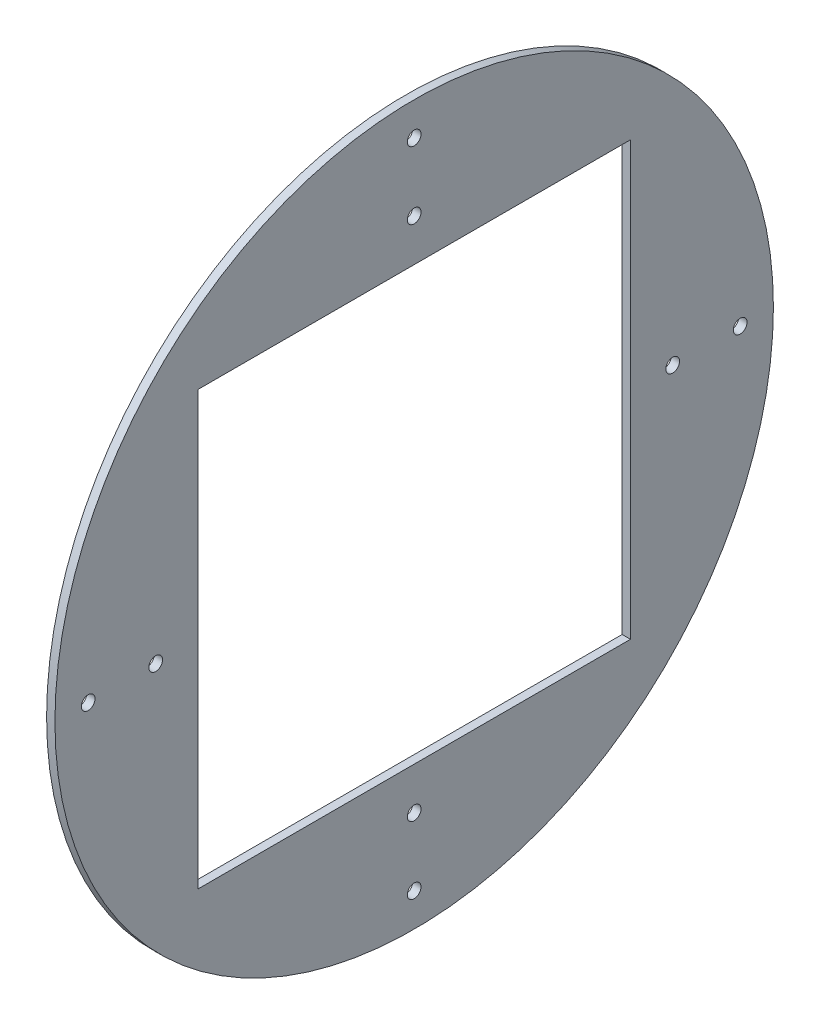
ISO-10303-21;
HEADER;
FILE_DESCRIPTION(('STEP AP214'),'2;1');
FILE_NAME('part.step','',(''),(''),'','','');
FILE_SCHEMA(('AUTOMOTIVE_DESIGN { 1 0 10303 214 1 1 1 1 }'));
ENDSEC;
DATA;
#1=APPLICATION_CONTEXT('core data for automotive mechanical design processes');
#2=APPLICATION_PROTOCOL_DEFINITION('international standard','automotive_design',2000,#1);
#3=PRODUCT_CONTEXT('',#1,'mechanical');
#4=PRODUCT('Part','Part','',(#3));
#5=PRODUCT_RELATED_PRODUCT_CATEGORY('part','',(#4));
#6=PRODUCT_DEFINITION_FORMATION('','',#4);
#7=PRODUCT_DEFINITION_CONTEXT('part definition',#1,'design');
#8=PRODUCT_DEFINITION('design','',#6,#7);
#9=PRODUCT_DEFINITION_SHAPE('','',#8);
#10=(LENGTH_UNIT() NAMED_UNIT(*) SI_UNIT(.MILLI.,.METRE.));
#11=(NAMED_UNIT(*) PLANE_ANGLE_UNIT() SI_UNIT($,.RADIAN.));
#12=(NAMED_UNIT(*) SI_UNIT($,.STERADIAN.) SOLID_ANGLE_UNIT());
#13=UNCERTAINTY_MEASURE_WITH_UNIT(LENGTH_MEASURE(1.E-05),#10,'distance_accuracy_value','');
#14=(GEOMETRIC_REPRESENTATION_CONTEXT(3) GLOBAL_UNCERTAINTY_ASSIGNED_CONTEXT((#13)) GLOBAL_UNIT_ASSIGNED_CONTEXT((#10,
#11,#12)) REPRESENTATION_CONTEXT('',''));
#15=CARTESIAN_POINT('',(0.,0.,0.));
#16=DIRECTION('',(0.,0.,1.));
#17=DIRECTION('',(1.,0.,0.));
#18=AXIS2_PLACEMENT_3D('',#15,#16,#17);
#19=CARTESIAN_POINT('',(2.0066,0.,0.));
#20=DIRECTION('',(1.,0.,0.));
#21=DIRECTION('',(0.,0.,-1.));
#22=AXIS2_PLACEMENT_3D('',#19,#20,#21);
#23=PLANE('',#22);
#24=CARTESIAN_POINT('',(2.0066,-2.74032404360442E-13,78.486));
#25=DIRECTION('',(1.,0.,0.));
#26=DIRECTION('',(0.,1.,0.));
#27=AXIS2_PLACEMENT_3D('',#24,#25,#26);
#28=CIRCLE('',#27,1.65100000000001);
#29=CARTESIAN_POINT('',(2.0066,1.65099999999973,78.486));
#30=VERTEX_POINT('',#29);
#31=EDGE_CURVE('E263',#30,#30,#28,.T.);
#32=ORIENTED_EDGE('',*,*,#31,.F.);
#33=EDGE_LOOP('',(#32));
#34=FACE_BOUND('',#33,.T.);
#35=CARTESIAN_POINT('',(2.0066,6.51824651148624E-13,-62.23));
#36=DIRECTION('',(1.,0.,0.));
#37=DIRECTION('',(0.,-1.,0.));
#38=AXIS2_PLACEMENT_3D('',#35,#36,#37);
#39=CIRCLE('',#38,1.651);
#40=CARTESIAN_POINT('',(2.0066,-1.65099999999935,-62.23));
#41=VERTEX_POINT('',#40);
#42=EDGE_CURVE('E280',#41,#41,#39,.T.);
#43=ORIENTED_EDGE('',*,*,#42,.F.);
#44=EDGE_LOOP('',(#43));
#45=FACE_BOUND('',#44,.T.);
#46=CARTESIAN_POINT('',(2.0066,-2.17274883716208E-13,62.23));
#47=DIRECTION('',(1.,0.,0.));
#48=DIRECTION('',(0.,1.,0.));
#49=AXIS2_PLACEMENT_3D('',#46,#47,#48);
#50=CIRCLE('',#49,1.651);
#51=CARTESIAN_POINT('',(2.0066,1.65099999999978,62.23));
#52=VERTEX_POINT('',#51);
#53=EDGE_CURVE('E272',#52,#52,#50,.T.);
#54=ORIENTED_EDGE('',*,*,#53,.F.);
#55=EDGE_LOOP('',(#54));
#56=FACE_BOUND('',#55,.T.);
#57=CARTESIAN_POINT('',(2.0066,-78.486,0.));
#58=DIRECTION('',(1.,0.,0.));
#59=DIRECTION('',(0.,0.,1.));
#60=AXIS2_PLACEMENT_3D('',#57,#58,#59);
#61=CIRCLE('',#60,1.65100000000001);
#62=CARTESIAN_POINT('',(2.0066,-78.486,1.65100000000001));
#63=VERTEX_POINT('',#62);
#64=EDGE_CURVE('E288',#63,#63,#61,.T.);
#65=ORIENTED_EDGE('',*,*,#64,.F.);
#66=EDGE_LOOP('',(#65));
#67=FACE_BOUND('',#66,.T.);
#68=CARTESIAN_POINT('',(2.0066,-62.23,0.));
#69=DIRECTION('',(1.,0.,0.));
#70=DIRECTION('',(0.,0.,1.));
#71=AXIS2_PLACEMENT_3D('',#68,#69,#70);
#72=CIRCLE('',#71,1.651);
#73=CARTESIAN_POINT('',(2.0066,-62.23,1.651));
#74=VERTEX_POINT('',#73);
#75=EDGE_CURVE('E289',#74,#74,#72,.T.);
#76=ORIENTED_EDGE('',*,*,#75,.F.);
#77=EDGE_LOOP('',(#76));
#78=FACE_BOUND('',#77,.T.);
#79=CARTESIAN_POINT('',(2.0066,8.22097213081327E-13,-78.486));
#80=DIRECTION('',(1.,0.,0.));
#81=DIRECTION('',(0.,-1.,0.));
#82=AXIS2_PLACEMENT_3D('',#79,#80,#81);
#83=CIRCLE('',#82,1.65100000000001);
#84=CARTESIAN_POINT('',(2.0066,-1.65099999999918,-78.486));
#85=VERTEX_POINT('',#84);
#86=EDGE_CURVE('E279',#85,#85,#83,.T.);
#87=ORIENTED_EDGE('',*,*,#86,.F.);
#88=EDGE_LOOP('',(#87));
#89=FACE_BOUND('',#88,.T.);
#90=CARTESIAN_POINT('',(2.0066,78.486,0.));
#91=DIRECTION('',(1.,0.,0.));
#92=DIRECTION('',(0.,0.,-1.));
#93=AXIS2_PLACEMENT_3D('',#90,#91,#92);
#94=CIRCLE('',#93,1.65100000000001);
#95=CARTESIAN_POINT('',(2.0066,78.486,-1.65100000000001));
#96=VERTEX_POINT('',#95);
#97=EDGE_CURVE('E313',#96,#96,#94,.T.);
#98=ORIENTED_EDGE('',*,*,#97,.F.);
#99=EDGE_LOOP('',(#98));
#100=FACE_BOUND('',#99,.T.);
#101=CARTESIAN_POINT('',(2.0066,62.23,0.));
#102=DIRECTION('',(1.,0.,0.));
#103=DIRECTION('',(0.,0.,-1.));
#104=AXIS2_PLACEMENT_3D('',#101,#102,#103);
#105=CIRCLE('',#104,1.651);
#106=CARTESIAN_POINT('',(2.0066,62.23,-1.651));
#107=VERTEX_POINT('',#106);
#108=EDGE_CURVE('E317',#107,#107,#105,.T.);
#109=ORIENTED_EDGE('',*,*,#108,.F.);
#110=EDGE_LOOP('',(#109));
#111=FACE_BOUND('',#110,.T.);
#112=CARTESIAN_POINT('',(2.0066,0.,0.));
#113=DIRECTION('',(1.,0.,0.));
#114=DIRECTION('',(0.,0.,-1.));
#115=AXIS2_PLACEMENT_3D('',#112,#113,#114);
#116=CIRCLE('',#115,86.487);
#117=CARTESIAN_POINT('',(2.0066,0.,-86.487));
#118=VERTEX_POINT('',#117);
#119=EDGE_CURVE('E11',#118,#118,#116,.T.);
#120=ORIENTED_EDGE('',*,*,#119,.T.);
#121=EDGE_LOOP('',(#120));
#122=FACE_BOUND('',#121,.T.);
#123=DIRECTION('',(0.,-1.,0.));
#124=VECTOR('',#123,1.);
#125=CARTESIAN_POINT('',(2.0066,52.07,-52.07));
#126=LINE('',#125,#124);
#127=CARTESIAN_POINT('',(2.0066,52.07,-52.07));
#128=VERTEX_POINT('',#127);
#129=CARTESIAN_POINT('',(2.0066,-52.07,-52.07));
#130=VERTEX_POINT('',#129);
#131=EDGE_CURVE('E97',#128,#130,#126,.T.);
#132=ORIENTED_EDGE('',*,*,#131,.T.);
#133=DIRECTION('',(0.,0.,1.));
#134=VECTOR('',#133,1.);
#135=CARTESIAN_POINT('',(2.0066,-52.07,-52.07));
#136=LINE('',#135,#134);
#137=CARTESIAN_POINT('',(2.0066,-52.07,52.07));
#138=VERTEX_POINT('',#137);
#139=EDGE_CURVE('E61',#130,#138,#136,.T.);
#140=ORIENTED_EDGE('',*,*,#139,.T.);
#141=DIRECTION('',(0.,-1.,0.));
#142=VECTOR('',#141,1.);
#143=CARTESIAN_POINT('',(2.0066,52.07,52.07));
#144=LINE('',#143,#142);
#145=CARTESIAN_POINT('',(2.0066,52.07,52.07));
#146=VERTEX_POINT('',#145);
#147=EDGE_CURVE('E103',#146,#138,#144,.T.);
#148=ORIENTED_EDGE('',*,*,#147,.F.);
#149=DIRECTION('',(0.,0.,1.));
#150=VECTOR('',#149,1.);
#151=CARTESIAN_POINT('',(2.0066,52.07,-52.07));
#152=LINE('',#151,#150);
#153=EDGE_CURVE('E122',#128,#146,#152,.T.);
#154=ORIENTED_EDGE('',*,*,#153,.F.);
#155=EDGE_LOOP('',(#132,#140,#148,#154));
#156=FACE_BOUND('',#155,.T.);
#157=ADVANCED_FACE('F45',(#34,#45,#56,#67,#78,#89,#100,#111,#122,#156),#23,.T.);
#158=CARTESIAN_POINT('',(0.,0.,0.));
#159=DIRECTION('',(1.,0.,0.));
#160=DIRECTION('',(0.,0.,-1.));
#161=AXIS2_PLACEMENT_3D('',#158,#159,#160);
#162=PLANE('',#161);
#163=CARTESIAN_POINT('',(0.,-2.74032404360442E-13,78.486));
#164=DIRECTION('',(1.,0.,0.));
#165=DIRECTION('',(0.,1.,0.));
#166=AXIS2_PLACEMENT_3D('',#163,#164,#165);
#167=CIRCLE('',#166,1.65100000000001);
#168=CARTESIAN_POINT('',(0.,1.65099999999973,78.486));
#169=VERTEX_POINT('',#168);
#170=EDGE_CURVE('E261',#169,#169,#167,.T.);
#171=ORIENTED_EDGE('',*,*,#170,.T.);
#172=EDGE_LOOP('',(#171));
#173=FACE_BOUND('',#172,.T.);
#174=CARTESIAN_POINT('',(0.,6.51824651148624E-13,-62.23));
#175=DIRECTION('',(1.,0.,0.));
#176=DIRECTION('',(0.,-1.,0.));
#177=AXIS2_PLACEMENT_3D('',#174,#175,#176);
#178=CIRCLE('',#177,1.651);
#179=CARTESIAN_POINT('',(0.,-1.65099999999935,-62.23));
#180=VERTEX_POINT('',#179);
#181=EDGE_CURVE('E275',#180,#180,#178,.T.);
#182=ORIENTED_EDGE('',*,*,#181,.T.);
#183=EDGE_LOOP('',(#182));
#184=FACE_BOUND('',#183,.T.);
#185=CARTESIAN_POINT('',(0.,-2.17274883716208E-13,62.23));
#186=DIRECTION('',(1.,0.,0.));
#187=DIRECTION('',(0.,1.,0.));
#188=AXIS2_PLACEMENT_3D('',#185,#186,#187);
#189=CIRCLE('',#188,1.651);
#190=CARTESIAN_POINT('',(0.,1.65099999999978,62.23));
#191=VERTEX_POINT('',#190);
#192=EDGE_CURVE('E265',#191,#191,#189,.T.);
#193=ORIENTED_EDGE('',*,*,#192,.T.);
#194=EDGE_LOOP('',(#193));
#195=FACE_BOUND('',#194,.T.);
#196=CARTESIAN_POINT('',(0.,-78.486,0.));
#197=DIRECTION('',(1.,0.,0.));
#198=DIRECTION('',(0.,0.,1.));
#199=AXIS2_PLACEMENT_3D('',#196,#197,#198);
#200=CIRCLE('',#199,1.65100000000001);
#201=CARTESIAN_POINT('',(0.,-78.486,1.65100000000001));
#202=VERTEX_POINT('',#201);
#203=EDGE_CURVE('E303',#202,#202,#200,.T.);
#204=ORIENTED_EDGE('',*,*,#203,.T.);
#205=EDGE_LOOP('',(#204));
#206=FACE_BOUND('',#205,.T.);
#207=CARTESIAN_POINT('',(0.,-62.23,0.));
#208=DIRECTION('',(1.,0.,0.));
#209=DIRECTION('',(0.,0.,1.));
#210=AXIS2_PLACEMENT_3D('',#207,#208,#209);
#211=CIRCLE('',#210,1.651);
#212=CARTESIAN_POINT('',(0.,-62.23,1.651));
#213=VERTEX_POINT('',#212);
#214=EDGE_CURVE('E284',#213,#213,#211,.T.);
#215=ORIENTED_EDGE('',*,*,#214,.T.);
#216=EDGE_LOOP('',(#215));
#217=FACE_BOUND('',#216,.T.);
#218=CARTESIAN_POINT('',(0.,8.22097213081327E-13,-78.486));
#219=DIRECTION('',(1.,0.,0.));
#220=DIRECTION('',(0.,-1.,0.));
#221=AXIS2_PLACEMENT_3D('',#218,#219,#220);
#222=CIRCLE('',#221,1.65100000000001);
#223=CARTESIAN_POINT('',(0.,-1.65099999999918,-78.486));
#224=VERTEX_POINT('',#223);
#225=EDGE_CURVE('E293',#224,#224,#222,.T.);
#226=ORIENTED_EDGE('',*,*,#225,.T.);
#227=EDGE_LOOP('',(#226));
#228=FACE_BOUND('',#227,.T.);
#229=CARTESIAN_POINT('',(0.,78.486,0.));
#230=DIRECTION('',(1.,0.,0.));
#231=DIRECTION('',(0.,0.,-1.));
#232=AXIS2_PLACEMENT_3D('',#229,#230,#231);
#233=CIRCLE('',#232,1.65100000000001);
#234=CARTESIAN_POINT('',(0.,78.486,-1.65100000000001));
#235=VERTEX_POINT('',#234);
#236=EDGE_CURVE('E119',#235,#235,#233,.T.);
#237=ORIENTED_EDGE('',*,*,#236,.T.);
#238=EDGE_LOOP('',(#237));
#239=FACE_BOUND('',#238,.T.);
#240=CARTESIAN_POINT('',(0.,62.23,0.));
#241=DIRECTION('',(1.,0.,0.));
#242=DIRECTION('',(0.,0.,-1.));
#243=AXIS2_PLACEMENT_3D('',#240,#241,#242);
#244=CIRCLE('',#243,1.651);
#245=CARTESIAN_POINT('',(0.,62.23,-1.651));
#246=VERTEX_POINT('',#245);
#247=EDGE_CURVE('E269',#246,#246,#244,.T.);
#248=ORIENTED_EDGE('',*,*,#247,.T.);
#249=EDGE_LOOP('',(#248));
#250=FACE_BOUND('',#249,.T.);
#251=CARTESIAN_POINT('',(0.,0.,0.));
#252=DIRECTION('',(1.,0.,0.));
#253=DIRECTION('',(0.,0.,-1.));
#254=AXIS2_PLACEMENT_3D('',#251,#252,#253);
#255=CIRCLE('',#254,86.487);
#256=CARTESIAN_POINT('',(0.,0.,-86.487));
#257=VERTEX_POINT('',#256);
#258=EDGE_CURVE('E49',#257,#257,#255,.T.);
#259=ORIENTED_EDGE('',*,*,#258,.F.);
#260=EDGE_LOOP('',(#259));
#261=FACE_BOUND('',#260,.T.);
#262=DIRECTION('',(0.,0.,1.));
#263=VECTOR('',#262,1.);
#264=CARTESIAN_POINT('',(0.,-52.07,-52.07));
#265=LINE('',#264,#263);
#266=CARTESIAN_POINT('',(0.,-52.07,-52.07));
#267=VERTEX_POINT('',#266);
#268=CARTESIAN_POINT('',(0.,-52.07,52.07));
#269=VERTEX_POINT('',#268);
#270=EDGE_CURVE('E86',#267,#269,#265,.T.);
#271=ORIENTED_EDGE('',*,*,#270,.F.);
#272=DIRECTION('',(0.,-1.,0.));
#273=VECTOR('',#272,1.);
#274=CARTESIAN_POINT('',(0.,52.07,-52.07));
#275=LINE('',#274,#273);
#276=CARTESIAN_POINT('',(0.,52.07,-52.07));
#277=VERTEX_POINT('',#276);
#278=EDGE_CURVE('E111',#277,#267,#275,.T.);
#279=ORIENTED_EDGE('',*,*,#278,.F.);
#280=DIRECTION('',(0.,0.,1.));
#281=VECTOR('',#280,1.);
#282=CARTESIAN_POINT('',(0.,52.07,-52.07));
#283=LINE('',#282,#281);
#284=CARTESIAN_POINT('',(0.,52.07,52.07));
#285=VERTEX_POINT('',#284);
#286=EDGE_CURVE('E69',#277,#285,#283,.T.);
#287=ORIENTED_EDGE('',*,*,#286,.T.);
#288=DIRECTION('',(0.,-1.,0.));
#289=VECTOR('',#288,1.);
#290=CARTESIAN_POINT('',(0.,52.07,52.07));
#291=LINE('',#290,#289);
#292=EDGE_CURVE('E96',#285,#269,#291,.T.);
#293=ORIENTED_EDGE('',*,*,#292,.T.);
#294=EDGE_LOOP('',(#271,#279,#287,#293));
#295=FACE_BOUND('',#294,.T.);
#296=ADVANCED_FACE('F107',(#173,#184,#195,#206,#217,#228,#239,#250,#261,#295),#162,.F.);
#297=CARTESIAN_POINT('',(2.0066,0.,0.));
#298=DIRECTION('',(-1.,0.,0.));
#299=DIRECTION('',(0.,0.,1.));
#300=AXIS2_PLACEMENT_3D('',#297,#298,#299);
#301=CYLINDRICAL_SURFACE('',#300,86.487);
#302=ORIENTED_EDGE('',*,*,#119,.F.);
#303=EDGE_LOOP('',(#302));
#304=FACE_BOUND('',#303,.T.);
#305=ORIENTED_EDGE('',*,*,#258,.T.);
#306=EDGE_LOOP('',(#305));
#307=FACE_BOUND('',#306,.T.);
#308=ADVANCED_FACE('F47',(#304,#307),#301,.T.);
#309=CARTESIAN_POINT('',(0.,-52.07,-52.07));
#310=DIRECTION('',(0.,1.,0.));
#311=DIRECTION('',(0.,0.,1.));
#312=AXIS2_PLACEMENT_3D('',#309,#310,#311);
#313=PLANE('',#312);
#314=ORIENTED_EDGE('',*,*,#139,.F.);
#315=DIRECTION('',(1.,0.,0.));
#316=VECTOR('',#315,1.);
#317=CARTESIAN_POINT('',(0.,-52.07,-52.07));
#318=LINE('',#317,#316);
#319=EDGE_CURVE('E91',#267,#130,#318,.T.);
#320=ORIENTED_EDGE('',*,*,#319,.F.);
#321=ORIENTED_EDGE('',*,*,#270,.T.);
#322=DIRECTION('',(1.,0.,0.));
#323=VECTOR('',#322,1.);
#324=CARTESIAN_POINT('',(0.,-52.07,52.07));
#325=LINE('',#324,#323);
#326=EDGE_CURVE('E89',#269,#138,#325,.T.);
#327=ORIENTED_EDGE('',*,*,#326,.T.);
#328=EDGE_LOOP('',(#314,#320,#321,#327));
#329=FACE_BOUND('',#328,.T.);
#330=ADVANCED_FACE('F88',(#329),#313,.T.);
#331=CARTESIAN_POINT('',(0.,52.07,52.07));
#332=DIRECTION('',(0.,0.,1.));
#333=DIRECTION('',(0.,-1.,0.));
#334=AXIS2_PLACEMENT_3D('',#331,#332,#333);
#335=PLANE('',#334);
#336=ORIENTED_EDGE('',*,*,#147,.T.);
#337=ORIENTED_EDGE('',*,*,#326,.F.);
#338=ORIENTED_EDGE('',*,*,#292,.F.);
#339=DIRECTION('',(1.,0.,0.));
#340=VECTOR('',#339,1.);
#341=CARTESIAN_POINT('',(0.,52.07,52.07));
#342=LINE('',#341,#340);
#343=EDGE_CURVE('E105',#285,#146,#342,.T.);
#344=ORIENTED_EDGE('',*,*,#343,.T.);
#345=EDGE_LOOP('',(#336,#337,#338,#344));
#346=FACE_BOUND('',#345,.T.);
#347=ADVANCED_FACE('F101',(#346),#335,.F.);
#348=CARTESIAN_POINT('',(0.,52.07,-52.07));
#349=DIRECTION('',(0.,1.,0.));
#350=DIRECTION('',(0.,0.,1.));
#351=AXIS2_PLACEMENT_3D('',#348,#349,#350);
#352=PLANE('',#351);
#353=ORIENTED_EDGE('',*,*,#153,.T.);
#354=ORIENTED_EDGE('',*,*,#343,.F.);
#355=ORIENTED_EDGE('',*,*,#286,.F.);
#356=DIRECTION('',(1.,0.,0.));
#357=VECTOR('',#356,1.);
#358=CARTESIAN_POINT('',(0.,52.07,-52.07));
#359=LINE('',#358,#357);
#360=EDGE_CURVE('E131',#277,#128,#359,.T.);
#361=ORIENTED_EDGE('',*,*,#360,.T.);
#362=EDGE_LOOP('',(#353,#354,#355,#361));
#363=FACE_BOUND('',#362,.T.);
#364=ADVANCED_FACE('F136',(#363),#352,.F.);
#365=CARTESIAN_POINT('',(0.,52.07,-52.07));
#366=DIRECTION('',(0.,0.,1.));
#367=DIRECTION('',(0.,-1.,0.));
#368=AXIS2_PLACEMENT_3D('',#365,#366,#367);
#369=PLANE('',#368);
#370=ORIENTED_EDGE('',*,*,#131,.F.);
#371=ORIENTED_EDGE('',*,*,#360,.F.);
#372=ORIENTED_EDGE('',*,*,#278,.T.);
#373=ORIENTED_EDGE('',*,*,#319,.T.);
#374=EDGE_LOOP('',(#370,#371,#372,#373));
#375=FACE_BOUND('',#374,.T.);
#376=ADVANCED_FACE('F140',(#375),#369,.T.);
#377=CARTESIAN_POINT('',(0.,62.23,0.));
#378=DIRECTION('',(1.,0.,0.));
#379=DIRECTION('',(0.,0.,-1.));
#380=AXIS2_PLACEMENT_3D('',#377,#378,#379);
#381=CYLINDRICAL_SURFACE('',#380,1.651);
#382=ORIENTED_EDGE('',*,*,#247,.F.);
#383=EDGE_LOOP('',(#382));
#384=FACE_BOUND('',#383,.T.);
#385=ORIENTED_EDGE('',*,*,#108,.T.);
#386=EDGE_LOOP('',(#385));
#387=FACE_BOUND('',#386,.T.);
#388=ADVANCED_FACE('F142',(#384,#387),#381,.F.);
#389=CARTESIAN_POINT('',(0.,78.486,0.));
#390=DIRECTION('',(1.,0.,0.));
#391=DIRECTION('',(0.,0.,-1.));
#392=AXIS2_PLACEMENT_3D('',#389,#390,#391);
#393=CYLINDRICAL_SURFACE('',#392,1.65100000000001);
#394=ORIENTED_EDGE('',*,*,#236,.F.);
#395=EDGE_LOOP('',(#394));
#396=FACE_BOUND('',#395,.T.);
#397=ORIENTED_EDGE('',*,*,#97,.T.);
#398=EDGE_LOOP('',(#397));
#399=FACE_BOUND('',#398,.T.);
#400=ADVANCED_FACE('F148',(#396,#399),#393,.F.);
#401=CARTESIAN_POINT('',(0.,8.22097213081327E-13,-78.486));
#402=DIRECTION('',(1.,0.,0.));
#403=DIRECTION('',(0.,0.,-1.));
#404=AXIS2_PLACEMENT_3D('',#401,#402,#403);
#405=CYLINDRICAL_SURFACE('',#404,1.65100000000001);
#406=ORIENTED_EDGE('',*,*,#225,.F.);
#407=EDGE_LOOP('',(#406));
#408=FACE_BOUND('',#407,.T.);
#409=ORIENTED_EDGE('',*,*,#86,.T.);
#410=EDGE_LOOP('',(#409));
#411=FACE_BOUND('',#410,.T.);
#412=ADVANCED_FACE('F195',(#408,#411),#405,.F.);
#413=CARTESIAN_POINT('',(0.,-62.23,0.));
#414=DIRECTION('',(1.,0.,0.));
#415=DIRECTION('',(0.,0.,-1.));
#416=AXIS2_PLACEMENT_3D('',#413,#414,#415);
#417=CYLINDRICAL_SURFACE('',#416,1.651);
#418=ORIENTED_EDGE('',*,*,#214,.F.);
#419=EDGE_LOOP('',(#418));
#420=FACE_BOUND('',#419,.T.);
#421=ORIENTED_EDGE('',*,*,#75,.T.);
#422=EDGE_LOOP('',(#421));
#423=FACE_BOUND('',#422,.T.);
#424=ADVANCED_FACE('F205',(#420,#423),#417,.F.);
#425=CARTESIAN_POINT('',(0.,-78.486,0.));
#426=DIRECTION('',(1.,0.,0.));
#427=DIRECTION('',(0.,0.,-1.));
#428=AXIS2_PLACEMENT_3D('',#425,#426,#427);
#429=CYLINDRICAL_SURFACE('',#428,1.65100000000001);
#430=ORIENTED_EDGE('',*,*,#203,.F.);
#431=EDGE_LOOP('',(#430));
#432=FACE_BOUND('',#431,.T.);
#433=ORIENTED_EDGE('',*,*,#64,.T.);
#434=EDGE_LOOP('',(#433));
#435=FACE_BOUND('',#434,.T.);
#436=ADVANCED_FACE('F215',(#432,#435),#429,.F.);
#437=CARTESIAN_POINT('',(0.,-2.17274883716208E-13,62.23));
#438=DIRECTION('',(1.,0.,0.));
#439=DIRECTION('',(0.,0.,-1.));
#440=AXIS2_PLACEMENT_3D('',#437,#438,#439);
#441=CYLINDRICAL_SURFACE('',#440,1.651);
#442=ORIENTED_EDGE('',*,*,#192,.F.);
#443=EDGE_LOOP('',(#442));
#444=FACE_BOUND('',#443,.T.);
#445=ORIENTED_EDGE('',*,*,#53,.T.);
#446=EDGE_LOOP('',(#445));
#447=FACE_BOUND('',#446,.T.);
#448=ADVANCED_FACE('F225',(#444,#447),#441,.F.);
#449=CARTESIAN_POINT('',(0.,6.51824651148624E-13,-62.23));
#450=DIRECTION('',(1.,0.,0.));
#451=DIRECTION('',(0.,0.,-1.));
#452=AXIS2_PLACEMENT_3D('',#449,#450,#451);
#453=CYLINDRICAL_SURFACE('',#452,1.651);
#454=ORIENTED_EDGE('',*,*,#181,.F.);
#455=EDGE_LOOP('',(#454));
#456=FACE_BOUND('',#455,.T.);
#457=ORIENTED_EDGE('',*,*,#42,.T.);
#458=EDGE_LOOP('',(#457));
#459=FACE_BOUND('',#458,.T.);
#460=ADVANCED_FACE('F235',(#456,#459),#453,.F.);
#461=CARTESIAN_POINT('',(0.,-2.74032404360442E-13,78.486));
#462=DIRECTION('',(1.,0.,0.));
#463=DIRECTION('',(0.,0.,-1.));
#464=AXIS2_PLACEMENT_3D('',#461,#462,#463);
#465=CYLINDRICAL_SURFACE('',#464,1.65100000000001);
#466=ORIENTED_EDGE('',*,*,#170,.F.);
#467=EDGE_LOOP('',(#466));
#468=FACE_BOUND('',#467,.T.);
#469=ORIENTED_EDGE('',*,*,#31,.T.);
#470=EDGE_LOOP('',(#469));
#471=FACE_BOUND('',#470,.T.);
#472=ADVANCED_FACE('F245',(#468,#471),#465,.F.);
#473=CLOSED_SHELL('',(#157,#296,#308,#330,#347,#364,#376,#388,#400,#412,#424,#436,#448,#460,#472));
#474=MANIFOLD_SOLID_BREP('B2',#473);
#475=ADVANCED_BREP_SHAPE_REPRESENTATION('',(#18,#474),#14);
#476=SHAPE_DEFINITION_REPRESENTATION(#9,#475);
ENDSEC;
END-ISO-10303-21;
